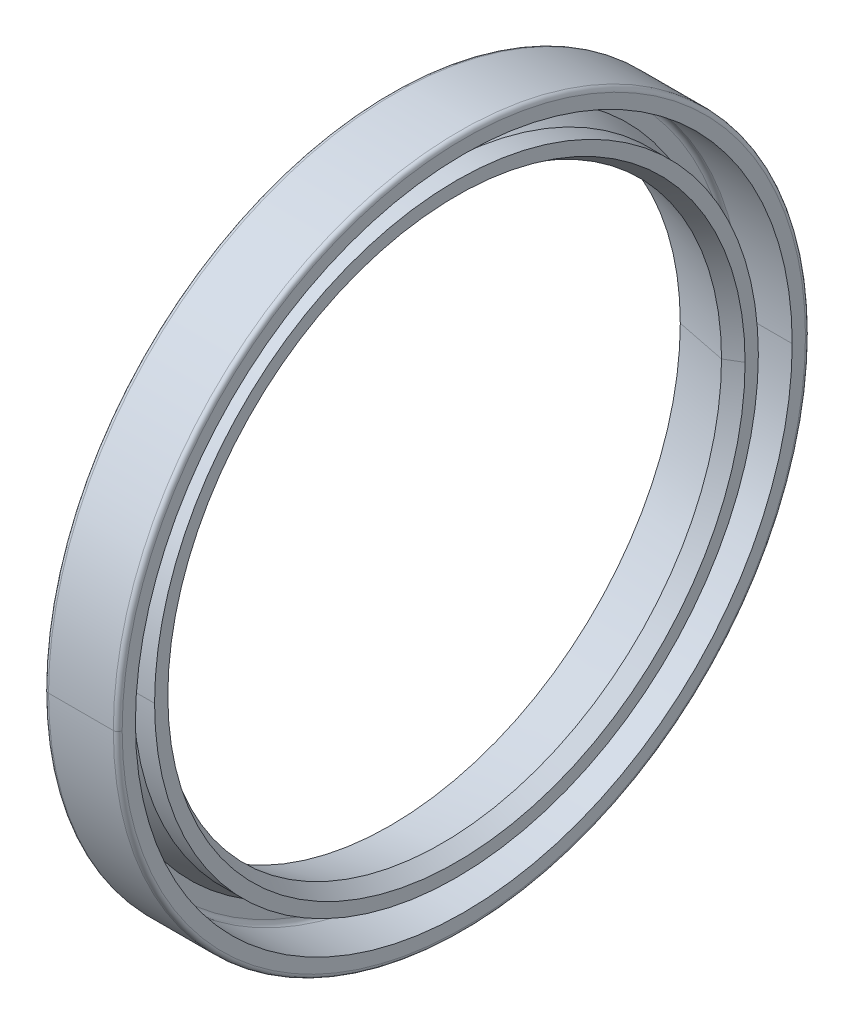
ISO-10303-21;
HEADER;
FILE_DESCRIPTION(('STEP AP214'),'2;1');
FILE_NAME('part.step','',(''),(''),'','','');
FILE_SCHEMA(('AUTOMOTIVE_DESIGN { 1 0 10303 214 1 1 1 1 }'));
ENDSEC;
DATA;
#1=APPLICATION_CONTEXT('core data for automotive mechanical design processes');
#2=APPLICATION_PROTOCOL_DEFINITION('international standard','automotive_design',2000,#1);
#3=PRODUCT_CONTEXT('',#1,'mechanical');
#4=PRODUCT('Part','Part','',(#3));
#5=PRODUCT_RELATED_PRODUCT_CATEGORY('part','',(#4));
#6=PRODUCT_DEFINITION_FORMATION('','',#4);
#7=PRODUCT_DEFINITION_CONTEXT('part definition',#1,'design');
#8=PRODUCT_DEFINITION('design','',#6,#7);
#9=PRODUCT_DEFINITION_SHAPE('','',#8);
#10=(LENGTH_UNIT() NAMED_UNIT(*) SI_UNIT(.MILLI.,.METRE.));
#11=(NAMED_UNIT(*) PLANE_ANGLE_UNIT() SI_UNIT($,.RADIAN.));
#12=(NAMED_UNIT(*) SI_UNIT($,.STERADIAN.) SOLID_ANGLE_UNIT());
#13=UNCERTAINTY_MEASURE_WITH_UNIT(LENGTH_MEASURE(1.E-05),#10,'distance_accuracy_value','');
#14=(GEOMETRIC_REPRESENTATION_CONTEXT(3) GLOBAL_UNCERTAINTY_ASSIGNED_CONTEXT((#13)) GLOBAL_UNIT_ASSIGNED_CONTEXT((#10,
#11,#12)) REPRESENTATION_CONTEXT('',''));
#15=CARTESIAN_POINT('',(0.,0.,0.));
#16=DIRECTION('',(0.,0.,1.));
#17=DIRECTION('',(1.,0.,0.));
#18=AXIS2_PLACEMENT_3D('',#15,#16,#17);
#19=CARTESIAN_POINT('',(5.,23.2,0.));
#20=DIRECTION('',(-1.,0.,0.));
#21=DIRECTION('',(0.,0.,1.));
#22=AXIS2_PLACEMENT_3D('',#19,#20,#21);
#23=PLANE('',#22);
#24=CARTESIAN_POINT('',(5.,0.,0.));
#25=DIRECTION('',(-1.,0.,0.));
#26=DIRECTION('',(0.,0.,1.));
#27=AXIS2_PLACEMENT_3D('',#24,#25,#26);
#28=CIRCLE('',#27,22.3);
#29=CARTESIAN_POINT('',(5.,0.,22.3));
#30=VERTEX_POINT('',#29);
#31=CARTESIAN_POINT('',(5.,0.,-22.3));
#32=VERTEX_POINT('',#31);
#33=EDGE_CURVE('E11',#30,#32,#28,.T.);
#34=ORIENTED_EDGE('',*,*,#33,.T.);
#35=CARTESIAN_POINT('',(5.,0.,0.));
#36=DIRECTION('',(-1.,0.,0.));
#37=DIRECTION('',(0.,0.,1.));
#38=AXIS2_PLACEMENT_3D('',#35,#36,#37);
#39=CIRCLE('',#38,22.3);
#40=EDGE_CURVE('E328',#32,#30,#39,.T.);
#41=ORIENTED_EDGE('',*,*,#40,.T.);
#42=EDGE_LOOP('',(#34,#41));
#43=FACE_BOUND('',#42,.T.);
#44=CARTESIAN_POINT('',(5.,0.,0.));
#45=DIRECTION('',(-1.,0.,0.));
#46=DIRECTION('',(0.,0.,1.));
#47=AXIS2_PLACEMENT_3D('',#44,#45,#46);
#48=CIRCLE('',#47,23.2);
#49=CARTESIAN_POINT('',(5.,0.,23.2));
#50=VERTEX_POINT('',#49);
#51=CARTESIAN_POINT('',(5.,0.,-23.2));
#52=VERTEX_POINT('',#51);
#53=EDGE_CURVE('E159',#50,#52,#48,.T.);
#54=ORIENTED_EDGE('',*,*,#53,.F.);
#55=CARTESIAN_POINT('',(5.,0.,0.));
#56=DIRECTION('',(-1.,0.,0.));
#57=DIRECTION('',(0.,0.,1.));
#58=AXIS2_PLACEMENT_3D('',#55,#56,#57);
#59=CIRCLE('',#58,23.2);
#60=EDGE_CURVE('E37',#52,#50,#59,.T.);
#61=ORIENTED_EDGE('',*,*,#60,.F.);
#62=EDGE_LOOP('',(#54,#61));
#63=FACE_BOUND('',#62,.T.);
#64=ADVANCED_FACE('F17',(#43,#63),#23,.F.);
#65=CARTESIAN_POINT('',(0.,0.,0.));
#66=DIRECTION('',(-1.,0.,0.));
#67=DIRECTION('',(0.,0.,1.));
#68=AXIS2_PLACEMENT_3D('',#65,#66,#67);
#69=CYLINDRICAL_SURFACE('',#68,22.3);
#70=DIRECTION('',(-1.,0.,0.));
#71=VECTOR('',#70,1.);
#72=CARTESIAN_POINT('',(0.,0.,-22.3));
#73=LINE('',#72,#71);
#74=CARTESIAN_POINT('',(1.55,0.,-22.3));
#75=VERTEX_POINT('',#74);
#76=EDGE_CURVE('E332',#32,#75,#73,.T.);
#77=ORIENTED_EDGE('',*,*,#76,.F.);
#78=ORIENTED_EDGE('',*,*,#33,.F.);
#79=DIRECTION('',(-1.,0.,0.));
#80=VECTOR('',#79,1.);
#81=CARTESIAN_POINT('',(0.,0.,22.3));
#82=LINE('',#81,#80);
#83=CARTESIAN_POINT('',(1.55,0.,22.3));
#84=VERTEX_POINT('',#83);
#85=EDGE_CURVE('E234',#30,#84,#82,.T.);
#86=ORIENTED_EDGE('',*,*,#85,.T.);
#87=CARTESIAN_POINT('',(1.55,0.,0.));
#88=DIRECTION('',(-1.,0.,0.));
#89=DIRECTION('',(0.,0.,1.));
#90=AXIS2_PLACEMENT_3D('',#87,#88,#89);
#91=CIRCLE('',#90,22.3);
#92=EDGE_CURVE('E25',#84,#75,#91,.T.);
#93=ORIENTED_EDGE('',*,*,#92,.T.);
#94=EDGE_LOOP('',(#77,#78,#86,#93));
#95=FACE_BOUND('',#94,.T.);
#96=ADVANCED_FACE('F316',(#95),#69,.F.);
#97=CARTESIAN_POINT('',(1.55,0.,0.));
#98=DIRECTION('',(-1.,0.,0.));
#99=DIRECTION('',(0.,0.,1.));
#100=AXIS2_PLACEMENT_3D('',#97,#98,#99);
#101=TOROIDAL_SURFACE('',#100,22.,0.3);
#102=CARTESIAN_POINT('',(1.55,0.,-22.));
#103=DIRECTION('',(0.,1.,0.));
#104=DIRECTION('',(0.,0.,1.));
#105=AXIS2_PLACEMENT_3D('',#102,#103,#104);
#106=CIRCLE('',#105,0.3);
#107=CARTESIAN_POINT('',(1.25,0.,-22.));
#108=VERTEX_POINT('',#107);
#109=EDGE_CURVE('E218',#75,#108,#106,.T.);
#110=ORIENTED_EDGE('',*,*,#109,.F.);
#111=ORIENTED_EDGE('',*,*,#92,.F.);
#112=CARTESIAN_POINT('',(1.55,0.,22.));
#113=DIRECTION('',(0.,-1.,0.));
#114=DIRECTION('',(0.,0.,-1.));
#115=AXIS2_PLACEMENT_3D('',#112,#113,#114);
#116=CIRCLE('',#115,0.3);
#117=CARTESIAN_POINT('',(1.25,0.,22.));
#118=VERTEX_POINT('',#117);
#119=EDGE_CURVE('E221',#84,#118,#116,.T.);
#120=ORIENTED_EDGE('',*,*,#119,.T.);
#121=CARTESIAN_POINT('',(1.25,0.,0.));
#122=DIRECTION('',(-1.,0.,0.));
#123=DIRECTION('',(0.,0.,1.));
#124=AXIS2_PLACEMENT_3D('',#121,#122,#123);
#125=CIRCLE('',#124,22.);
#126=EDGE_CURVE('E189',#118,#108,#125,.T.);
#127=ORIENTED_EDGE('',*,*,#126,.T.);
#128=EDGE_LOOP('',(#110,#111,#120,#127));
#129=FACE_BOUND('',#128,.T.);
#130=ADVANCED_FACE('F216',(#129),#101,.F.);
#131=CARTESIAN_POINT('',(1.25,22.,0.));
#132=DIRECTION('',(-1.,0.,0.));
#133=DIRECTION('',(0.,0.,1.));
#134=AXIS2_PLACEMENT_3D('',#131,#132,#133);
#135=PLANE('',#134);
#136=CARTESIAN_POINT('',(1.25,0.,0.));
#137=DIRECTION('',(-1.,0.,0.));
#138=DIRECTION('',(0.,0.,1.));
#139=AXIS2_PLACEMENT_3D('',#136,#137,#138);
#140=CIRCLE('',#139,21.);
#141=CARTESIAN_POINT('',(1.25,0.,21.));
#142=VERTEX_POINT('',#141);
#143=CARTESIAN_POINT('',(1.25,0.,-21.));
#144=VERTEX_POINT('',#143);
#145=EDGE_CURVE('E254',#142,#144,#140,.T.);
#146=ORIENTED_EDGE('',*,*,#145,.T.);
#147=CARTESIAN_POINT('',(1.25,0.,0.));
#148=DIRECTION('',(-1.,0.,0.));
#149=DIRECTION('',(0.,0.,1.));
#150=AXIS2_PLACEMENT_3D('',#147,#148,#149);
#151=CIRCLE('',#150,21.);
#152=EDGE_CURVE('E182',#144,#142,#151,.T.);
#153=ORIENTED_EDGE('',*,*,#152,.T.);
#154=EDGE_LOOP('',(#146,#153));
#155=FACE_BOUND('',#154,.T.);
#156=ORIENTED_EDGE('',*,*,#126,.F.);
#157=CARTESIAN_POINT('',(1.25,0.,0.));
#158=DIRECTION('',(-1.,0.,0.));
#159=DIRECTION('',(0.,0.,1.));
#160=AXIS2_PLACEMENT_3D('',#157,#158,#159);
#161=CIRCLE('',#160,22.);
#162=EDGE_CURVE('E224',#108,#118,#161,.T.);
#163=ORIENTED_EDGE('',*,*,#162,.F.);
#164=EDGE_LOOP('',(#156,#163));
#165=FACE_BOUND('',#164,.T.);
#166=ADVANCED_FACE('F225',(#155,#165),#135,.F.);
#167=CARTESIAN_POINT('',(3.05,0.,0.));
#168=DIRECTION('',(-1.,0.,0.));
#169=DIRECTION('',(0.,0.,1.));
#170=AXIS2_PLACEMENT_3D('',#167,#168,#169);
#171=CONICAL_SURFACE('',#170,20.5,0.270946850338421);
#172=DIRECTION('',(-0.963517909629941,0.,-0.267643863786095));
#173=VECTOR('',#172,1.);
#174=CARTESIAN_POINT('',(3.05,0.,-20.5));
#175=LINE('',#174,#173);
#176=CARTESIAN_POINT('',(3.05,0.,-20.5));
#177=VERTEX_POINT('',#176);
#178=EDGE_CURVE('E249',#177,#144,#175,.T.);
#179=ORIENTED_EDGE('',*,*,#178,.F.);
#180=CARTESIAN_POINT('',(3.05,0.,0.));
#181=DIRECTION('',(-1.,0.,0.));
#182=DIRECTION('',(0.,0.,1.));
#183=AXIS2_PLACEMENT_3D('',#180,#181,#182);
#184=CIRCLE('',#183,20.5);
#185=CARTESIAN_POINT('',(3.05,0.,20.5));
#186=VERTEX_POINT('',#185);
#187=EDGE_CURVE('E179',#177,#186,#184,.T.);
#188=ORIENTED_EDGE('',*,*,#187,.T.);
#189=DIRECTION('',(-0.963517909629941,0.,0.267643863786095));
#190=VECTOR('',#189,1.);
#191=CARTESIAN_POINT('',(3.05,0.,20.5));
#192=LINE('',#191,#190);
#193=EDGE_CURVE('E258',#186,#142,#192,.T.);
#194=ORIENTED_EDGE('',*,*,#193,.T.);
#195=ORIENTED_EDGE('',*,*,#152,.F.);
#196=EDGE_LOOP('',(#179,#188,#194,#195));
#197=FACE_BOUND('',#196,.T.);
#198=ADVANCED_FACE('F583',(#197),#171,.T.);
#199=CARTESIAN_POINT('',(0.,0.,0.));
#200=DIRECTION('',(-1.,0.,0.));
#201=DIRECTION('',(0.,0.,1.));
#202=AXIS2_PLACEMENT_3D('',#199,#200,#201);
#203=CYLINDRICAL_SURFACE('',#202,20.5);
#204=DIRECTION('',(-1.,0.,0.));
#205=VECTOR('',#204,1.);
#206=CARTESIAN_POINT('',(0.,0.,-20.5));
#207=LINE('',#206,#205);
#208=CARTESIAN_POINT('',(4.5,0.,-20.5));
#209=VERTEX_POINT('',#208);
#210=EDGE_CURVE('E268',#209,#177,#207,.T.);
#211=ORIENTED_EDGE('',*,*,#210,.F.);
#212=CARTESIAN_POINT('',(4.5,0.,0.));
#213=DIRECTION('',(-1.,0.,0.));
#214=DIRECTION('',(0.,0.,1.));
#215=AXIS2_PLACEMENT_3D('',#212,#213,#214);
#216=CIRCLE('',#215,20.5);
#217=CARTESIAN_POINT('',(4.5,0.,20.5));
#218=VERTEX_POINT('',#217);
#219=EDGE_CURVE('E183',#209,#218,#216,.T.);
#220=ORIENTED_EDGE('',*,*,#219,.T.);
#221=DIRECTION('',(-1.,0.,0.));
#222=VECTOR('',#221,1.);
#223=CARTESIAN_POINT('',(0.,0.,20.5));
#224=LINE('',#223,#222);
#225=EDGE_CURVE('E263',#218,#186,#224,.T.);
#226=ORIENTED_EDGE('',*,*,#225,.T.);
#227=ORIENTED_EDGE('',*,*,#187,.F.);
#228=EDGE_LOOP('',(#211,#220,#226,#227));
#229=FACE_BOUND('',#228,.T.);
#230=ADVANCED_FACE('F574',(#229),#203,.T.);
#231=CARTESIAN_POINT('',(4.5,20.5,0.));
#232=DIRECTION('',(-1.,0.,0.));
#233=DIRECTION('',(0.,0.,1.));
#234=AXIS2_PLACEMENT_3D('',#231,#232,#233);
#235=PLANE('',#234);
#236=CARTESIAN_POINT('',(4.5,0.,0.));
#237=DIRECTION('',(-1.,0.,0.));
#238=DIRECTION('',(0.,0.,1.));
#239=AXIS2_PLACEMENT_3D('',#236,#237,#238);
#240=CIRCLE('',#239,19.6);
#241=CARTESIAN_POINT('',(4.5,0.,-19.6));
#242=VERTEX_POINT('',#241);
#243=CARTESIAN_POINT('',(4.5,0.,19.6));
#244=VERTEX_POINT('',#243);
#245=EDGE_CURVE('E245',#242,#244,#240,.T.);
#246=ORIENTED_EDGE('',*,*,#245,.T.);
#247=CARTESIAN_POINT('',(4.5,0.,0.));
#248=DIRECTION('',(-1.,0.,0.));
#249=DIRECTION('',(0.,0.,1.));
#250=AXIS2_PLACEMENT_3D('',#247,#248,#249);
#251=CIRCLE('',#250,19.6);
#252=EDGE_CURVE('E202',#244,#242,#251,.T.);
#253=ORIENTED_EDGE('',*,*,#252,.T.);
#254=EDGE_LOOP('',(#246,#253));
#255=FACE_BOUND('',#254,.T.);
#256=CARTESIAN_POINT('',(4.5,0.,0.));
#257=DIRECTION('',(-1.,0.,0.));
#258=DIRECTION('',(0.,0.,1.));
#259=AXIS2_PLACEMENT_3D('',#256,#257,#258);
#260=CIRCLE('',#259,20.5);
#261=EDGE_CURVE('E262',#218,#209,#260,.T.);
#262=ORIENTED_EDGE('',*,*,#261,.F.);
#263=ORIENTED_EDGE('',*,*,#219,.F.);
#264=EDGE_LOOP('',(#262,#263));
#265=FACE_BOUND('',#264,.T.);
#266=ADVANCED_FACE('F515',(#255,#265),#235,.F.);
#267=CARTESIAN_POINT('',(3.5,0.,0.));
#268=DIRECTION('',(1.,0.,0.));
#269=DIRECTION('',(0.,0.,-1.));
#270=AXIS2_PLACEMENT_3D('',#267,#268,#269);
#271=CONICAL_SURFACE('',#270,19.,0.540419500270585);
#272=DIRECTION('',(0.857492925712544,0.,0.514495755427527));
#273=VECTOR('',#272,1.);
#274=CARTESIAN_POINT('',(3.5,0.,19.));
#275=LINE('',#274,#273);
#276=CARTESIAN_POINT('',(3.5,0.,19.));
#277=VERTEX_POINT('',#276);
#278=EDGE_CURVE('E345',#277,#244,#275,.T.);
#279=ORIENTED_EDGE('',*,*,#278,.F.);
#280=CARTESIAN_POINT('',(3.5,0.,0.));
#281=DIRECTION('',(-1.,0.,0.));
#282=DIRECTION('',(0.,0.,1.));
#283=AXIS2_PLACEMENT_3D('',#280,#281,#282);
#284=CIRCLE('',#283,19.);
#285=CARTESIAN_POINT('',(3.5,0.,-19.));
#286=VERTEX_POINT('',#285);
#287=EDGE_CURVE('E199',#277,#286,#284,.T.);
#288=ORIENTED_EDGE('',*,*,#287,.T.);
#289=DIRECTION('',(0.857492925712544,0.,-0.514495755427527));
#290=VECTOR('',#289,1.);
#291=CARTESIAN_POINT('',(3.5,0.,-19.));
#292=LINE('',#291,#290);
#293=EDGE_CURVE('E269',#286,#242,#292,.T.);
#294=ORIENTED_EDGE('',*,*,#293,.T.);
#295=ORIENTED_EDGE('',*,*,#252,.F.);
#296=EDGE_LOOP('',(#279,#288,#294,#295));
#297=FACE_BOUND('',#296,.T.);
#298=ADVANCED_FACE('F511',(#297),#271,.F.);
#299=CARTESIAN_POINT('',(0.,0.,0.));
#300=DIRECTION('',(-1.,0.,0.));
#301=DIRECTION('',(0.,0.,1.));
#302=AXIS2_PLACEMENT_3D('',#299,#300,#301);
#303=CONICAL_SURFACE('',#302,19.7,0.19739555984988);
#304=DIRECTION('',(-0.98058067569092,0.,-0.196116135138184));
#305=VECTOR('',#304,1.);
#306=CARTESIAN_POINT('',(0.,0.,-19.7));
#307=LINE('',#306,#305);
#308=CARTESIAN_POINT('',(0.,0.,-19.7));
#309=VERTEX_POINT('',#308);
#310=EDGE_CURVE('E273',#286,#309,#307,.T.);
#311=ORIENTED_EDGE('',*,*,#310,.F.);
#312=ORIENTED_EDGE('',*,*,#287,.F.);
#313=DIRECTION('',(-0.98058067569092,0.,0.196116135138184));
#314=VECTOR('',#313,1.);
#315=CARTESIAN_POINT('',(0.,0.,19.7));
#316=LINE('',#315,#314);
#317=CARTESIAN_POINT('',(0.,0.,19.7));
#318=VERTEX_POINT('',#317);
#319=EDGE_CURVE('E281',#277,#318,#316,.T.);
#320=ORIENTED_EDGE('',*,*,#319,.T.);
#321=CARTESIAN_POINT('',(0.,0.,0.));
#322=DIRECTION('',(-1.,0.,0.));
#323=DIRECTION('',(0.,0.,1.));
#324=AXIS2_PLACEMENT_3D('',#321,#322,#323);
#325=CIRCLE('',#324,19.7);
#326=EDGE_CURVE('E196',#318,#309,#325,.T.);
#327=ORIENTED_EDGE('',*,*,#326,.T.);
#328=EDGE_LOOP('',(#311,#312,#320,#327));
#329=FACE_BOUND('',#328,.T.);
#330=ADVANCED_FACE('F311',(#329),#303,.F.);
#331=CARTESIAN_POINT('',(0.,23.2,0.));
#332=DIRECTION('',(1.,0.,0.));
#333=DIRECTION('',(0.,1.,0.));
#334=AXIS2_PLACEMENT_3D('',#331,#332,#333);
#335=PLANE('',#334);
#336=ORIENTED_EDGE('',*,*,#326,.F.);
#337=CARTESIAN_POINT('',(0.,0.,0.));
#338=DIRECTION('',(-1.,0.,0.));
#339=DIRECTION('',(0.,0.,1.));
#340=AXIS2_PLACEMENT_3D('',#337,#338,#339);
#341=CIRCLE('',#340,19.7);
#342=EDGE_CURVE('E277',#309,#318,#341,.T.);
#343=ORIENTED_EDGE('',*,*,#342,.F.);
#344=EDGE_LOOP('',(#336,#343));
#345=FACE_BOUND('',#344,.T.);
#346=CARTESIAN_POINT('',(0.,0.,0.));
#347=DIRECTION('',(-1.,0.,0.));
#348=DIRECTION('',(0.,0.,1.));
#349=AXIS2_PLACEMENT_3D('',#346,#347,#348);
#350=CIRCLE('',#349,23.2);
#351=CARTESIAN_POINT('',(0.,0.,23.2));
#352=VERTEX_POINT('',#351);
#353=CARTESIAN_POINT('',(0.,0.,-23.2));
#354=VERTEX_POINT('',#353);
#355=EDGE_CURVE('E172',#352,#354,#350,.T.);
#356=ORIENTED_EDGE('',*,*,#355,.T.);
#357=CARTESIAN_POINT('',(0.,0.,0.));
#358=DIRECTION('',(-1.,0.,0.));
#359=DIRECTION('',(0.,0.,1.));
#360=AXIS2_PLACEMENT_3D('',#357,#358,#359);
#361=CIRCLE('',#360,23.2);
#362=EDGE_CURVE('E193',#354,#352,#361,.T.);
#363=ORIENTED_EDGE('',*,*,#362,.T.);
#364=EDGE_LOOP('',(#356,#363));
#365=FACE_BOUND('',#364,.T.);
#366=ADVANCED_FACE('F298',(#345,#365),#335,.F.);
#367=CARTESIAN_POINT('',(0.3,0.,0.));
#368=DIRECTION('',(-1.,0.,0.));
#369=DIRECTION('',(0.,0.,1.));
#370=AXIS2_PLACEMENT_3D('',#367,#368,#369);
#371=TOROIDAL_SURFACE('',#370,23.2,0.3);
#372=CARTESIAN_POINT('',(0.3,0.,-23.2));
#373=DIRECTION('',(0.,1.,0.));
#374=DIRECTION('',(0.,0.,1.));
#375=AXIS2_PLACEMENT_3D('',#372,#373,#374);
#376=CIRCLE('',#375,0.3);
#377=CARTESIAN_POINT('',(0.3,0.,-23.5));
#378=VERTEX_POINT('',#377);
#379=EDGE_CURVE('E286',#378,#354,#376,.T.);
#380=ORIENTED_EDGE('',*,*,#379,.F.);
#381=CARTESIAN_POINT('',(0.3,0.,0.));
#382=DIRECTION('',(-1.,0.,0.));
#383=DIRECTION('',(0.,0.,1.));
#384=AXIS2_PLACEMENT_3D('',#381,#382,#383);
#385=CIRCLE('',#384,23.5);
#386=CARTESIAN_POINT('',(0.3,0.,23.5));
#387=VERTEX_POINT('',#386);
#388=EDGE_CURVE('E142',#378,#387,#385,.T.);
#389=ORIENTED_EDGE('',*,*,#388,.T.);
#390=CARTESIAN_POINT('',(0.3,0.,23.2));
#391=DIRECTION('',(0.,-1.,0.));
#392=DIRECTION('',(0.,0.,-1.));
#393=AXIS2_PLACEMENT_3D('',#390,#391,#392);
#394=CIRCLE('',#393,0.3);
#395=EDGE_CURVE('E163',#387,#352,#394,.T.);
#396=ORIENTED_EDGE('',*,*,#395,.T.);
#397=ORIENTED_EDGE('',*,*,#362,.F.);
#398=EDGE_LOOP('',(#380,#389,#396,#397));
#399=FACE_BOUND('',#398,.T.);
#400=ADVANCED_FACE('F301',(#399),#371,.T.);
#401=CARTESIAN_POINT('',(0.,0.,0.));
#402=DIRECTION('',(-1.,0.,0.));
#403=DIRECTION('',(0.,0.,1.));
#404=AXIS2_PLACEMENT_3D('',#401,#402,#403);
#405=CYLINDRICAL_SURFACE('',#404,23.5);
#406=DIRECTION('',(-1.,0.,0.));
#407=VECTOR('',#406,1.);
#408=CARTESIAN_POINT('',(0.,0.,-23.5));
#409=LINE('',#408,#407);
#410=CARTESIAN_POINT('',(4.7,0.,-23.5));
#411=VERTEX_POINT('',#410);
#412=EDGE_CURVE('E138',#411,#378,#409,.T.);
#413=ORIENTED_EDGE('',*,*,#412,.F.);
#414=CARTESIAN_POINT('',(4.7,0.,0.));
#415=DIRECTION('',(-1.,0.,0.));
#416=DIRECTION('',(0.,0.,1.));
#417=AXIS2_PLACEMENT_3D('',#414,#415,#416);
#418=CIRCLE('',#417,23.5);
#419=CARTESIAN_POINT('',(4.7,0.,23.5));
#420=VERTEX_POINT('',#419);
#421=EDGE_CURVE('E132',#411,#420,#418,.T.);
#422=ORIENTED_EDGE('',*,*,#421,.T.);
#423=DIRECTION('',(-1.,0.,0.));
#424=VECTOR('',#423,1.);
#425=CARTESIAN_POINT('',(0.,0.,23.5));
#426=LINE('',#425,#424);
#427=EDGE_CURVE('E135',#420,#387,#426,.T.);
#428=ORIENTED_EDGE('',*,*,#427,.T.);
#429=ORIENTED_EDGE('',*,*,#388,.F.);
#430=EDGE_LOOP('',(#413,#422,#428,#429));
#431=FACE_BOUND('',#430,.T.);
#432=ADVANCED_FACE('F133',(#431),#405,.T.);
#433=CARTESIAN_POINT('',(4.7,0.,0.));
#434=DIRECTION('',(-1.,0.,0.));
#435=DIRECTION('',(0.,0.,1.));
#436=AXIS2_PLACEMENT_3D('',#433,#434,#435);
#437=TOROIDAL_SURFACE('',#436,23.2,0.3);
#438=CARTESIAN_POINT('',(4.7,0.,-23.2));
#439=DIRECTION('',(0.,1.,0.));
#440=DIRECTION('',(0.,0.,1.));
#441=AXIS2_PLACEMENT_3D('',#438,#439,#440);
#442=CIRCLE('',#441,0.3);
#443=EDGE_CURVE('E150',#52,#411,#442,.T.);
#444=ORIENTED_EDGE('',*,*,#443,.F.);
#445=ORIENTED_EDGE('',*,*,#60,.T.);
#446=CARTESIAN_POINT('',(4.7,0.,23.2));
#447=DIRECTION('',(0.,-1.,0.));
#448=DIRECTION('',(0.,0.,-1.));
#449=AXIS2_PLACEMENT_3D('',#446,#447,#448);
#450=CIRCLE('',#449,0.3);
#451=EDGE_CURVE('E144',#50,#420,#450,.T.);
#452=ORIENTED_EDGE('',*,*,#451,.T.);
#453=ORIENTED_EDGE('',*,*,#421,.F.);
#454=EDGE_LOOP('',(#444,#445,#452,#453));
#455=FACE_BOUND('',#454,.T.);
#456=ADVANCED_FACE('F145',(#455),#437,.T.);
#457=CARTESIAN_POINT('',(4.7,0.,0.));
#458=DIRECTION('',(-1.,0.,0.));
#459=DIRECTION('',(0.,0.,1.));
#460=AXIS2_PLACEMENT_3D('',#457,#458,#459);
#461=TOROIDAL_SURFACE('',#460,23.2,0.3);
#462=ORIENTED_EDGE('',*,*,#53,.T.);
#463=ORIENTED_EDGE('',*,*,#443,.T.);
#464=CARTESIAN_POINT('',(4.7,0.,0.));
#465=DIRECTION('',(-1.,0.,0.));
#466=DIRECTION('',(0.,0.,1.));
#467=AXIS2_PLACEMENT_3D('',#464,#465,#466);
#468=CIRCLE('',#467,23.5);
#469=EDGE_CURVE('E155',#420,#411,#468,.T.);
#470=ORIENTED_EDGE('',*,*,#469,.F.);
#471=ORIENTED_EDGE('',*,*,#451,.F.);
#472=EDGE_LOOP('',(#462,#463,#470,#471));
#473=FACE_BOUND('',#472,.T.);
#474=ADVANCED_FACE('F161',(#473),#461,.T.);
#475=CARTESIAN_POINT('',(0.,0.,0.));
#476=DIRECTION('',(-1.,0.,0.));
#477=DIRECTION('',(0.,0.,1.));
#478=AXIS2_PLACEMENT_3D('',#475,#476,#477);
#479=CYLINDRICAL_SURFACE('',#478,23.5);
#480=ORIENTED_EDGE('',*,*,#469,.T.);
#481=ORIENTED_EDGE('',*,*,#412,.T.);
#482=CARTESIAN_POINT('',(0.3,0.,0.));
#483=DIRECTION('',(-1.,0.,0.));
#484=DIRECTION('',(0.,0.,1.));
#485=AXIS2_PLACEMENT_3D('',#482,#483,#484);
#486=CIRCLE('',#485,23.5);
#487=EDGE_CURVE('E157',#387,#378,#486,.T.);
#488=ORIENTED_EDGE('',*,*,#487,.F.);
#489=ORIENTED_EDGE('',*,*,#427,.F.);
#490=EDGE_LOOP('',(#480,#481,#488,#489));
#491=FACE_BOUND('',#490,.T.);
#492=ADVANCED_FACE('F154',(#491),#479,.T.);
#493=CARTESIAN_POINT('',(0.3,0.,0.));
#494=DIRECTION('',(-1.,0.,0.));
#495=DIRECTION('',(0.,0.,1.));
#496=AXIS2_PLACEMENT_3D('',#493,#494,#495);
#497=TOROIDAL_SURFACE('',#496,23.2,0.3);
#498=ORIENTED_EDGE('',*,*,#487,.T.);
#499=ORIENTED_EDGE('',*,*,#379,.T.);
#500=ORIENTED_EDGE('',*,*,#355,.F.);
#501=ORIENTED_EDGE('',*,*,#395,.F.);
#502=EDGE_LOOP('',(#498,#499,#500,#501));
#503=FACE_BOUND('',#502,.T.);
#504=ADVANCED_FACE('F299',(#503),#497,.T.);
#505=CARTESIAN_POINT('',(0.,0.,0.));
#506=DIRECTION('',(-1.,0.,0.));
#507=DIRECTION('',(0.,0.,1.));
#508=AXIS2_PLACEMENT_3D('',#505,#506,#507);
#509=CONICAL_SURFACE('',#508,19.7,0.19739555984988);
#510=CARTESIAN_POINT('',(3.5,0.,0.));
#511=DIRECTION('',(-1.,0.,0.));
#512=DIRECTION('',(0.,0.,1.));
#513=AXIS2_PLACEMENT_3D('',#510,#511,#512);
#514=CIRCLE('',#513,19.);
#515=EDGE_CURVE('E267',#286,#277,#514,.T.);
#516=ORIENTED_EDGE('',*,*,#515,.F.);
#517=ORIENTED_EDGE('',*,*,#310,.T.);
#518=ORIENTED_EDGE('',*,*,#342,.T.);
#519=ORIENTED_EDGE('',*,*,#319,.F.);
#520=EDGE_LOOP('',(#516,#517,#518,#519));
#521=FACE_BOUND('',#520,.T.);
#522=ADVANCED_FACE('F462',(#521),#509,.F.);
#523=CARTESIAN_POINT('',(3.5,0.,0.));
#524=DIRECTION('',(1.,0.,0.));
#525=DIRECTION('',(0.,0.,-1.));
#526=AXIS2_PLACEMENT_3D('',#523,#524,#525);
#527=CONICAL_SURFACE('',#526,19.,0.540419500270585);
#528=ORIENTED_EDGE('',*,*,#515,.T.);
#529=ORIENTED_EDGE('',*,*,#278,.T.);
#530=ORIENTED_EDGE('',*,*,#245,.F.);
#531=ORIENTED_EDGE('',*,*,#293,.F.);
#532=EDGE_LOOP('',(#528,#529,#530,#531));
#533=FACE_BOUND('',#532,.T.);
#534=ADVANCED_FACE('F466',(#533),#527,.F.);
#535=CARTESIAN_POINT('',(0.,0.,0.));
#536=DIRECTION('',(-1.,0.,0.));
#537=DIRECTION('',(0.,0.,1.));
#538=AXIS2_PLACEMENT_3D('',#535,#536,#537);
#539=CYLINDRICAL_SURFACE('',#538,20.5);
#540=ORIENTED_EDGE('',*,*,#261,.T.);
#541=ORIENTED_EDGE('',*,*,#210,.T.);
#542=CARTESIAN_POINT('',(3.05,0.,0.));
#543=DIRECTION('',(-1.,0.,0.));
#544=DIRECTION('',(0.,0.,1.));
#545=AXIS2_PLACEMENT_3D('',#542,#543,#544);
#546=CIRCLE('',#545,20.5);
#547=EDGE_CURVE('E247',#186,#177,#546,.T.);
#548=ORIENTED_EDGE('',*,*,#547,.F.);
#549=ORIENTED_EDGE('',*,*,#225,.F.);
#550=EDGE_LOOP('',(#540,#541,#548,#549));
#551=FACE_BOUND('',#550,.T.);
#552=ADVANCED_FACE('F497',(#551),#539,.T.);
#553=CARTESIAN_POINT('',(3.05,0.,0.));
#554=DIRECTION('',(-1.,0.,0.));
#555=DIRECTION('',(0.,0.,1.));
#556=AXIS2_PLACEMENT_3D('',#553,#554,#555);
#557=CONICAL_SURFACE('',#556,20.5,0.270946850338421);
#558=ORIENTED_EDGE('',*,*,#547,.T.);
#559=ORIENTED_EDGE('',*,*,#178,.T.);
#560=ORIENTED_EDGE('',*,*,#145,.F.);
#561=ORIENTED_EDGE('',*,*,#193,.F.);
#562=EDGE_LOOP('',(#558,#559,#560,#561));
#563=FACE_BOUND('',#562,.T.);
#564=ADVANCED_FACE('F482',(#563),#557,.T.);
#565=CARTESIAN_POINT('',(1.55,0.,0.));
#566=DIRECTION('',(-1.,0.,0.));
#567=DIRECTION('',(0.,0.,1.));
#568=AXIS2_PLACEMENT_3D('',#565,#566,#567);
#569=TOROIDAL_SURFACE('',#568,22.,0.3);
#570=CARTESIAN_POINT('',(1.55,0.,0.));
#571=DIRECTION('',(-1.,0.,0.));
#572=DIRECTION('',(0.,0.,1.));
#573=AXIS2_PLACEMENT_3D('',#570,#571,#572);
#574=CIRCLE('',#573,22.3);
#575=EDGE_CURVE('E231',#75,#84,#574,.T.);
#576=ORIENTED_EDGE('',*,*,#575,.F.);
#577=ORIENTED_EDGE('',*,*,#109,.T.);
#578=ORIENTED_EDGE('',*,*,#162,.T.);
#579=ORIENTED_EDGE('',*,*,#119,.F.);
#580=EDGE_LOOP('',(#576,#577,#578,#579));
#581=FACE_BOUND('',#580,.T.);
#582=ADVANCED_FACE('F229',(#581),#569,.F.);
#583=CARTESIAN_POINT('',(0.,0.,0.));
#584=DIRECTION('',(-1.,0.,0.));
#585=DIRECTION('',(0.,0.,1.));
#586=AXIS2_PLACEMENT_3D('',#583,#584,#585);
#587=CYLINDRICAL_SURFACE('',#586,22.3);
#588=ORIENTED_EDGE('',*,*,#40,.F.);
#589=ORIENTED_EDGE('',*,*,#76,.T.);
#590=ORIENTED_EDGE('',*,*,#575,.T.);
#591=ORIENTED_EDGE('',*,*,#85,.F.);
#592=EDGE_LOOP('',(#588,#589,#590,#591));
#593=FACE_BOUND('',#592,.T.);
#594=ADVANCED_FACE('F336',(#593),#587,.F.);
#595=CLOSED_SHELL('',(#64,#96,#130,#166,#198,#230,#266,#298,#330,#366,#400,#432,#456,#474,#492,
#504,#522,#534,#552,#564,#582,#594));
#596=MANIFOLD_SOLID_BREP('B1',#595);
#597=ADVANCED_BREP_SHAPE_REPRESENTATION('',(#18,#596),#14);
#598=SHAPE_DEFINITION_REPRESENTATION(#9,#597);
ENDSEC;
END-ISO-10303-21;
